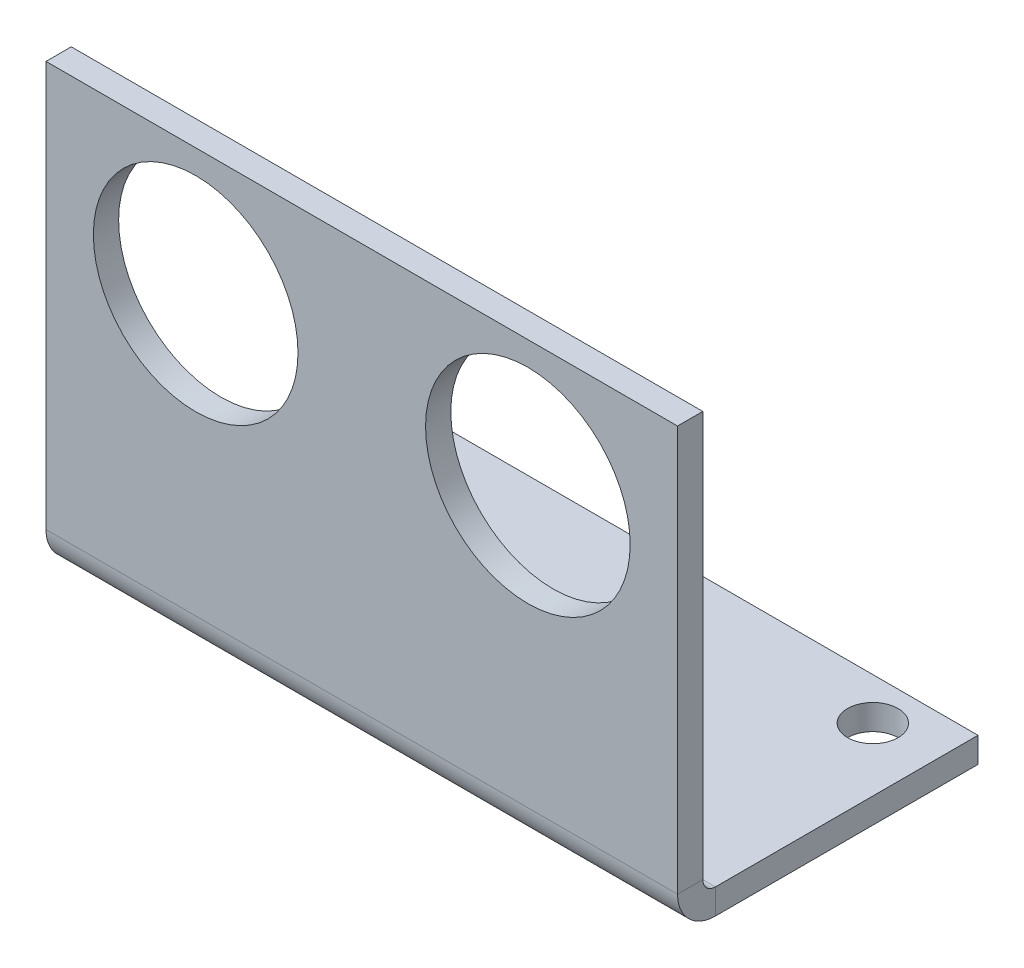
ISO-10303-21;
HEADER;
FILE_DESCRIPTION(('STEP AP214'),'2;1');
FILE_NAME('part.step','',(''),(''),'','','');
FILE_SCHEMA(('AUTOMOTIVE_DESIGN { 1 0 10303 214 1 1 1 1 }'));
ENDSEC;
DATA;
#1=APPLICATION_CONTEXT('core data for automotive mechanical design processes');
#2=APPLICATION_PROTOCOL_DEFINITION('international standard','automotive_design',2000,#1);
#3=PRODUCT_CONTEXT('',#1,'mechanical');
#4=PRODUCT('Part','Part','',(#3));
#5=PRODUCT_RELATED_PRODUCT_CATEGORY('part','',(#4));
#6=PRODUCT_DEFINITION_FORMATION('','',#4);
#7=PRODUCT_DEFINITION_CONTEXT('part definition',#1,'design');
#8=PRODUCT_DEFINITION('design','',#6,#7);
#9=PRODUCT_DEFINITION_SHAPE('','',#8);
#10=(LENGTH_UNIT() NAMED_UNIT(*) SI_UNIT(.MILLI.,.METRE.));
#11=(NAMED_UNIT(*) PLANE_ANGLE_UNIT() SI_UNIT($,.RADIAN.));
#12=(NAMED_UNIT(*) SI_UNIT($,.STERADIAN.) SOLID_ANGLE_UNIT());
#13=UNCERTAINTY_MEASURE_WITH_UNIT(LENGTH_MEASURE(1.E-05),#10,'distance_accuracy_value','');
#14=(GEOMETRIC_REPRESENTATION_CONTEXT(3) GLOBAL_UNCERTAINTY_ASSIGNED_CONTEXT((#13)) GLOBAL_UNIT_ASSIGNED_CONTEXT((#10,
#11,#12)) REPRESENTATION_CONTEXT('',''));
#15=CARTESIAN_POINT('',(0.,0.,0.));
#16=DIRECTION('',(0.,0.,1.));
#17=DIRECTION('',(1.,0.,0.));
#18=AXIS2_PLACEMENT_3D('',#15,#16,#17);
#19=CARTESIAN_POINT('',(0.,0.,2.));
#20=DIRECTION('',(0.,0.,-1.));
#21=DIRECTION('',(-1.,0.,0.));
#22=AXIS2_PLACEMENT_3D('',#19,#20,#21);
#23=PLANE('',#22);
#24=DIRECTION('',(0.,1.,0.));
#25=VECTOR('',#24,1.);
#26=CARTESIAN_POINT('',(25.,-15.,2.));
#27=LINE('',#26,#25);
#28=CARTESIAN_POINT('',(25.,-17.099519781874,2.));
#29=VERTEX_POINT('',#28);
#30=CARTESIAN_POINT('',(25.,15.,2.));
#31=VERTEX_POINT('',#30);
#32=EDGE_CURVE('E226',#29,#31,#27,.T.);
#33=ORIENTED_EDGE('',*,*,#32,.T.);
#34=DIRECTION('',(-1.,0.,0.));
#35=VECTOR('',#34,1.);
#36=CARTESIAN_POINT('',(-25.,15.,2.));
#37=LINE('',#36,#35);
#38=CARTESIAN_POINT('',(-25.,15.,2.));
#39=VERTEX_POINT('',#38);
#40=EDGE_CURVE('E57',#31,#39,#37,.T.);
#41=ORIENTED_EDGE('',*,*,#40,.T.);
#42=DIRECTION('',(0.,-1.,0.));
#43=VECTOR('',#42,1.);
#44=CARTESIAN_POINT('',(-25.,-15.,2.));
#45=LINE('',#44,#43);
#46=CARTESIAN_POINT('',(-25.,-17.099519781874,2.));
#47=VERTEX_POINT('',#46);
#48=EDGE_CURVE('E107',#39,#47,#45,.T.);
#49=ORIENTED_EDGE('',*,*,#48,.T.);
#50=DIRECTION('',(-1.,0.,0.));
#51=VECTOR('',#50,1.);
#52=CARTESIAN_POINT('',(25.,-17.099519781874,2.));
#53=LINE('',#52,#51);
#54=EDGE_CURVE('E111',#29,#47,#53,.T.);
#55=ORIENTED_EDGE('',*,*,#54,.F.);
#56=EDGE_LOOP('',(#33,#41,#49,#55));
#57=FACE_BOUND('',#56,.T.);
#58=CARTESIAN_POINT('',(13.15,5.,2.));
#59=DIRECTION('',(0.,0.,1.));
#60=DIRECTION('',(1.,0.,0.));
#61=AXIS2_PLACEMENT_3D('',#58,#59,#60);
#62=CIRCLE('',#61,8.1);
#63=CARTESIAN_POINT('',(21.25,5.,2.));
#64=VERTEX_POINT('',#63);
#65=EDGE_CURVE('E218',#64,#64,#62,.T.);
#66=ORIENTED_EDGE('',*,*,#65,.F.);
#67=EDGE_LOOP('',(#66));
#68=FACE_BOUND('',#67,.T.);
#69=CARTESIAN_POINT('',(-13.15,5.,2.));
#70=DIRECTION('',(0.,0.,1.));
#71=DIRECTION('',(-1.,0.,0.));
#72=AXIS2_PLACEMENT_3D('',#69,#70,#71);
#73=CIRCLE('',#72,8.1);
#74=CARTESIAN_POINT('',(-21.25,5.,2.));
#75=VERTEX_POINT('',#74);
#76=EDGE_CURVE('E210',#75,#75,#73,.T.);
#77=ORIENTED_EDGE('',*,*,#76,.F.);
#78=EDGE_LOOP('',(#77));
#79=FACE_BOUND('',#78,.T.);
#80=ADVANCED_FACE('F39',(#57,#68,#79),#23,.F.);
#81=CARTESIAN_POINT('',(0.,0.,0.));
#82=DIRECTION('',(0.,0.,-1.));
#83=DIRECTION('',(-1.,0.,0.));
#84=AXIS2_PLACEMENT_3D('',#81,#82,#83);
#85=PLANE('',#84);
#86=CARTESIAN_POINT('',(13.15,5.,0.));
#87=DIRECTION('',(0.,0.,1.));
#88=DIRECTION('',(1.,0.,0.));
#89=AXIS2_PLACEMENT_3D('',#86,#87,#88);
#90=CIRCLE('',#89,8.1);
#91=CARTESIAN_POINT('',(21.25,5.,0.));
#92=VERTEX_POINT('',#91);
#93=EDGE_CURVE('E214',#92,#92,#90,.T.);
#94=ORIENTED_EDGE('',*,*,#93,.T.);
#95=EDGE_LOOP('',(#94));
#96=FACE_BOUND('',#95,.T.);
#97=DIRECTION('',(0.,1.,0.));
#98=VECTOR('',#97,1.);
#99=CARTESIAN_POINT('',(25.,-15.,0.));
#100=LINE('',#99,#98);
#101=CARTESIAN_POINT('',(25.,-17.099519781874,0.));
#102=VERTEX_POINT('',#101);
#103=CARTESIAN_POINT('',(25.,15.,0.));
#104=VERTEX_POINT('',#103);
#105=EDGE_CURVE('E222',#102,#104,#100,.T.);
#106=ORIENTED_EDGE('',*,*,#105,.F.);
#107=DIRECTION('',(1.,0.,0.));
#108=VECTOR('',#107,1.);
#109=CARTESIAN_POINT('',(-25.,-17.099519781874,0.));
#110=LINE('',#109,#108);
#111=CARTESIAN_POINT('',(-25.,-17.099519781874,0.));
#112=VERTEX_POINT('',#111);
#113=EDGE_CURVE('E143',#112,#102,#110,.T.);
#114=ORIENTED_EDGE('',*,*,#113,.F.);
#115=DIRECTION('',(0.,-1.,0.));
#116=VECTOR('',#115,1.);
#117=CARTESIAN_POINT('',(-25.,-15.,0.));
#118=LINE('',#117,#116);
#119=CARTESIAN_POINT('',(-25.,15.,0.));
#120=VERTEX_POINT('',#119);
#121=EDGE_CURVE('E140',#120,#112,#118,.T.);
#122=ORIENTED_EDGE('',*,*,#121,.F.);
#123=DIRECTION('',(-1.,0.,0.));
#124=VECTOR('',#123,1.);
#125=CARTESIAN_POINT('',(-25.,15.,0.));
#126=LINE('',#125,#124);
#127=EDGE_CURVE('E68',#104,#120,#126,.T.);
#128=ORIENTED_EDGE('',*,*,#127,.F.);
#129=EDGE_LOOP('',(#106,#114,#122,#128));
#130=FACE_BOUND('',#129,.T.);
#131=CARTESIAN_POINT('',(-13.15,5.,0.));
#132=DIRECTION('',(0.,0.,1.));
#133=DIRECTION('',(-1.,0.,0.));
#134=AXIS2_PLACEMENT_3D('',#131,#132,#133);
#135=CIRCLE('',#134,8.1);
#136=CARTESIAN_POINT('',(-21.25,5.,0.));
#137=VERTEX_POINT('',#136);
#138=EDGE_CURVE('E209',#137,#137,#135,.T.);
#139=ORIENTED_EDGE('',*,*,#138,.T.);
#140=EDGE_LOOP('',(#139));
#141=FACE_BOUND('',#140,.T.);
#142=ADVANCED_FACE('F240',(#96,#130,#141),#85,.T.);
#143=CARTESIAN_POINT('',(25.,-15.,2.));
#144=DIRECTION('',(-1.,0.,0.));
#145=DIRECTION('',(0.,0.,1.));
#146=AXIS2_PLACEMENT_3D('',#143,#144,#145);
#147=PLANE('',#146);
#148=ORIENTED_EDGE('',*,*,#105,.T.);
#149=DIRECTION('',(0.,0.,-1.));
#150=VECTOR('',#149,1.);
#151=CARTESIAN_POINT('',(25.,15.,2.));
#152=LINE('',#151,#150);
#153=EDGE_CURVE('E11',#31,#104,#152,.T.);
#154=ORIENTED_EDGE('',*,*,#153,.F.);
#155=ORIENTED_EDGE('',*,*,#32,.F.);
#156=DIRECTION('',(0.,0.,1.));
#157=VECTOR('',#156,1.);
#158=CARTESIAN_POINT('',(25.,-17.099519781874,0.));
#159=LINE('',#158,#157);
#160=EDGE_CURVE('E137',#102,#29,#159,.T.);
#161=ORIENTED_EDGE('',*,*,#160,.F.);
#162=EDGE_LOOP('',(#148,#154,#155,#161));
#163=FACE_BOUND('',#162,.T.);
#164=ADVANCED_FACE('F41',(#163),#147,.F.);
#165=CARTESIAN_POINT('',(-25.,15.,2.));
#166=DIRECTION('',(0.,-1.,0.));
#167=DIRECTION('',(1.,0.,0.));
#168=AXIS2_PLACEMENT_3D('',#165,#166,#167);
#169=PLANE('',#168);
#170=ORIENTED_EDGE('',*,*,#127,.T.);
#171=DIRECTION('',(0.,0.,-1.));
#172=VECTOR('',#171,1.);
#173=CARTESIAN_POINT('',(-25.,15.,2.));
#174=LINE('',#173,#172);
#175=EDGE_CURVE('E49',#39,#120,#174,.T.);
#176=ORIENTED_EDGE('',*,*,#175,.F.);
#177=ORIENTED_EDGE('',*,*,#40,.F.);
#178=ORIENTED_EDGE('',*,*,#153,.T.);
#179=EDGE_LOOP('',(#170,#176,#177,#178));
#180=FACE_BOUND('',#179,.T.);
#181=ADVANCED_FACE('F288',(#180),#169,.F.);
#182=CARTESIAN_POINT('',(-25.,-15.,2.));
#183=DIRECTION('',(1.,0.,0.));
#184=DIRECTION('',(0.,0.,-1.));
#185=AXIS2_PLACEMENT_3D('',#182,#183,#184);
#186=PLANE('',#185);
#187=ORIENTED_EDGE('',*,*,#121,.T.);
#188=DIRECTION('',(0.,0.,-1.));
#189=VECTOR('',#188,1.);
#190=CARTESIAN_POINT('',(-25.,-17.099519781874,2.));
#191=LINE('',#190,#189);
#192=EDGE_CURVE('E125',#47,#112,#191,.T.);
#193=ORIENTED_EDGE('',*,*,#192,.F.);
#194=ORIENTED_EDGE('',*,*,#48,.F.);
#195=ORIENTED_EDGE('',*,*,#175,.T.);
#196=EDGE_LOOP('',(#187,#193,#194,#195));
#197=FACE_BOUND('',#196,.T.);
#198=ADVANCED_FACE('F139',(#197),#186,.F.);
#199=CARTESIAN_POINT('',(13.15,5.,2.));
#200=DIRECTION('',(0.,0.,-1.));
#201=DIRECTION('',(-1.,0.,0.));
#202=AXIS2_PLACEMENT_3D('',#199,#200,#201);
#203=CYLINDRICAL_SURFACE('',#202,8.1);
#204=ORIENTED_EDGE('',*,*,#65,.T.);
#205=EDGE_LOOP('',(#204));
#206=FACE_BOUND('',#205,.T.);
#207=ORIENTED_EDGE('',*,*,#93,.F.);
#208=EDGE_LOOP('',(#207));
#209=FACE_BOUND('',#208,.T.);
#210=ADVANCED_FACE('F270',(#206,#209),#203,.F.);
#211=CARTESIAN_POINT('',(-13.15,5.,2.));
#212=DIRECTION('',(0.,0.,-1.));
#213=DIRECTION('',(-1.,0.,0.));
#214=AXIS2_PLACEMENT_3D('',#211,#212,#213);
#215=CYLINDRICAL_SURFACE('',#214,8.1);
#216=ORIENTED_EDGE('',*,*,#76,.T.);
#217=EDGE_LOOP('',(#216));
#218=FACE_BOUND('',#217,.T.);
#219=ORIENTED_EDGE('',*,*,#138,.F.);
#220=EDGE_LOOP('',(#219));
#221=FACE_BOUND('',#220,.T.);
#222=ADVANCED_FACE('F262',(#218,#221),#215,.F.);
#223=CARTESIAN_POINT('',(0.,-18.099519781874,-21.7876275037138));
#224=DIRECTION('',(0.,0.,-1.));
#225=DIRECTION('',(0.,1.,0.));
#226=AXIS2_PLACEMENT_3D('',#223,#224,#225);
#227=PLANE('',#226);
#228=DIRECTION('',(0.,1.,0.));
#229=VECTOR('',#228,1.);
#230=CARTESIAN_POINT('',(-25.,-20.099519781874,-21.7876275037138));
#231=LINE('',#230,#229);
#232=CARTESIAN_POINT('',(-25.,-20.099519781874,-21.7876275037138));
#233=VERTEX_POINT('',#232);
#234=CARTESIAN_POINT('',(-25.,-18.099519781874,-21.7876275037138));
#235=VERTEX_POINT('',#234);
#236=EDGE_CURVE('E163',#233,#235,#231,.T.);
#237=ORIENTED_EDGE('',*,*,#236,.T.);
#238=DIRECTION('',(1.,0.,0.));
#239=VECTOR('',#238,1.);
#240=CARTESIAN_POINT('',(-25.,-18.099519781874,-21.7876275037138));
#241=LINE('',#240,#239);
#242=CARTESIAN_POINT('',(25.,-18.099519781874,-21.7876275037138));
#243=VERTEX_POINT('',#242);
#244=EDGE_CURVE('E171',#235,#243,#241,.T.);
#245=ORIENTED_EDGE('',*,*,#244,.T.);
#246=DIRECTION('',(0.,-1.,0.));
#247=VECTOR('',#246,1.);
#248=CARTESIAN_POINT('',(25.,-18.099519781874,-21.7876275037138));
#249=LINE('',#248,#247);
#250=CARTESIAN_POINT('',(25.,-20.099519781874,-21.7876275037138));
#251=VERTEX_POINT('',#250);
#252=EDGE_CURVE('E75',#243,#251,#249,.T.);
#253=ORIENTED_EDGE('',*,*,#252,.T.);
#254=DIRECTION('',(-1.,0.,0.));
#255=VECTOR('',#254,1.);
#256=CARTESIAN_POINT('',(25.,-20.099519781874,-21.7876275037138));
#257=LINE('',#256,#255);
#258=EDGE_CURVE('E202',#251,#233,#257,.T.);
#259=ORIENTED_EDGE('',*,*,#258,.T.);
#260=EDGE_LOOP('',(#237,#245,#253,#259));
#261=FACE_BOUND('',#260,.T.);
#262=ADVANCED_FACE('F260',(#261),#227,.T.);
#263=CARTESIAN_POINT('',(-25.,-17.099519781874,1.99999999999987));
#264=DIRECTION('',(-1.,0.,0.));
#265=DIRECTION('',(0.,0.,1.));
#266=AXIS2_PLACEMENT_3D('',#263,#264,#265);
#267=PLANE('',#266);
#268=CARTESIAN_POINT('',(-25.,-17.099519781874,-1.));
#269=DIRECTION('',(1.,0.,0.));
#270=DIRECTION('',(0.,0.,1.));
#271=AXIS2_PLACEMENT_3D('',#268,#269,#270);
#272=CIRCLE('',#271,0.999999999999869);
#273=CARTESIAN_POINT('',(-25.,-18.0995197818739,-1.00000000000001));
#274=VERTEX_POINT('',#273);
#275=EDGE_CURVE('E159',#112,#274,#272,.T.);
#276=ORIENTED_EDGE('',*,*,#275,.T.);
#277=DIRECTION('',(0.,1.,0.));
#278=VECTOR('',#277,1.);
#279=CARTESIAN_POINT('',(-25.,-20.099519781874,-1.00000000000002));
#280=LINE('',#279,#278);
#281=CARTESIAN_POINT('',(-25.,-20.0995197818739,-1.00000000000002));
#282=VERTEX_POINT('',#281);
#283=EDGE_CURVE('E127',#282,#274,#280,.T.);
#284=ORIENTED_EDGE('',*,*,#283,.F.);
#285=CARTESIAN_POINT('',(-25.,-17.099519781874,-1.));
#286=DIRECTION('',(1.,0.,0.));
#287=DIRECTION('',(0.,0.,1.));
#288=AXIS2_PLACEMENT_3D('',#285,#286,#287);
#289=CIRCLE('',#288,2.99999999999987);
#290=EDGE_CURVE('E122',#47,#282,#289,.T.);
#291=ORIENTED_EDGE('',*,*,#290,.F.);
#292=ORIENTED_EDGE('',*,*,#192,.T.);
#293=EDGE_LOOP('',(#276,#284,#291,#292));
#294=FACE_BOUND('',#293,.T.);
#295=ADVANCED_FACE('F124',(#294),#267,.T.);
#296=CARTESIAN_POINT('',(25.,-17.099519781874,-1.));
#297=DIRECTION('',(1.,0.,0.));
#298=DIRECTION('',(0.,0.,-1.));
#299=AXIS2_PLACEMENT_3D('',#296,#297,#298);
#300=CYLINDRICAL_SURFACE('',#299,0.999999999999869);
#301=CARTESIAN_POINT('',(25.,-17.099519781874,-1.));
#302=DIRECTION('',(1.,0.,0.));
#303=DIRECTION('',(0.,0.,1.));
#304=AXIS2_PLACEMENT_3D('',#301,#302,#303);
#305=CIRCLE('',#304,0.999999999999869);
#306=CARTESIAN_POINT('',(25.,-18.0995197818739,-1.00000000000001));
#307=VERTEX_POINT('',#306);
#308=EDGE_CURVE('E179',#102,#307,#305,.T.);
#309=ORIENTED_EDGE('',*,*,#308,.T.);
#310=DIRECTION('',(1.,0.,0.));
#311=VECTOR('',#310,1.);
#312=CARTESIAN_POINT('',(-25.,-18.099519781874,-1.00000000000001));
#313=LINE('',#312,#311);
#314=EDGE_CURVE('E161',#274,#307,#313,.T.);
#315=ORIENTED_EDGE('',*,*,#314,.F.);
#316=ORIENTED_EDGE('',*,*,#275,.F.);
#317=ORIENTED_EDGE('',*,*,#113,.T.);
#318=EDGE_LOOP('',(#309,#315,#316,#317));
#319=FACE_BOUND('',#318,.T.);
#320=ADVANCED_FACE('F244',(#319),#300,.F.);
#321=CARTESIAN_POINT('',(25.,-17.099519781874,-1.30537941567255E-13));
#322=DIRECTION('',(1.,0.,0.));
#323=DIRECTION('',(0.,0.,-1.));
#324=AXIS2_PLACEMENT_3D('',#321,#322,#323);
#325=PLANE('',#324);
#326=CARTESIAN_POINT('',(25.,-17.099519781874,-1.));
#327=DIRECTION('',(1.,0.,0.));
#328=DIRECTION('',(0.,0.,1.));
#329=AXIS2_PLACEMENT_3D('',#326,#327,#328);
#330=CIRCLE('',#329,2.99999999999987);
#331=CARTESIAN_POINT('',(25.,-20.0995197818739,-1.00000000000002));
#332=VERTEX_POINT('',#331);
#333=EDGE_CURVE('E135',#29,#332,#330,.T.);
#334=ORIENTED_EDGE('',*,*,#333,.T.);
#335=DIRECTION('',(0.,-1.,0.));
#336=VECTOR('',#335,1.);
#337=CARTESIAN_POINT('',(25.,-18.099519781874,-1.00000000000001));
#338=LINE('',#337,#336);
#339=EDGE_CURVE('E183',#307,#332,#338,.T.);
#340=ORIENTED_EDGE('',*,*,#339,.F.);
#341=ORIENTED_EDGE('',*,*,#308,.F.);
#342=ORIENTED_EDGE('',*,*,#160,.T.);
#343=EDGE_LOOP('',(#334,#340,#341,#342));
#344=FACE_BOUND('',#343,.T.);
#345=ADVANCED_FACE('F253',(#344),#325,.T.);
#346=CARTESIAN_POINT('',(25.,-17.099519781874,-1.));
#347=DIRECTION('',(1.,0.,0.));
#348=DIRECTION('',(0.,0.,-1.));
#349=AXIS2_PLACEMENT_3D('',#346,#347,#348);
#350=CYLINDRICAL_SURFACE('',#349,2.99999999999987);
#351=DIRECTION('',(-1.,0.,0.));
#352=VECTOR('',#351,1.);
#353=CARTESIAN_POINT('',(25.,-20.099519781874,-1.00000000000002));
#354=LINE('',#353,#352);
#355=EDGE_CURVE('E174',#332,#282,#354,.T.);
#356=ORIENTED_EDGE('',*,*,#355,.F.);
#357=ORIENTED_EDGE('',*,*,#333,.F.);
#358=ORIENTED_EDGE('',*,*,#54,.T.);
#359=ORIENTED_EDGE('',*,*,#290,.T.);
#360=EDGE_LOOP('',(#356,#357,#358,#359));
#361=FACE_BOUND('',#360,.T.);
#362=ADVANCED_FACE('F133',(#361),#350,.T.);
#363=CARTESIAN_POINT('',(-25.,-20.099519781874,-1.00000000000001));
#364=DIRECTION('',(-1.,0.,0.));
#365=DIRECTION('',(0.,0.,1.));
#366=AXIS2_PLACEMENT_3D('',#363,#364,#365);
#367=PLANE('',#366);
#368=DIRECTION('',(0.,0.,-1.));
#369=VECTOR('',#368,1.);
#370=CARTESIAN_POINT('',(-25.,-18.099519781874,-1.00000000000001));
#371=LINE('',#370,#369);
#372=EDGE_CURVE('E166',#274,#235,#371,.T.);
#373=ORIENTED_EDGE('',*,*,#372,.T.);
#374=ORIENTED_EDGE('',*,*,#236,.F.);
#375=DIRECTION('',(0.,0.,-1.));
#376=VECTOR('',#375,1.);
#377=CARTESIAN_POINT('',(-25.,-20.099519781874,-1.00000000000001));
#378=LINE('',#377,#376);
#379=EDGE_CURVE('E167',#282,#233,#378,.T.);
#380=ORIENTED_EDGE('',*,*,#379,.F.);
#381=ORIENTED_EDGE('',*,*,#283,.T.);
#382=EDGE_LOOP('',(#373,#374,#380,#381));
#383=FACE_BOUND('',#382,.T.);
#384=ADVANCED_FACE('F247',(#383),#367,.T.);
#385=CARTESIAN_POINT('',(-25.,-18.099519781874,-1.00000000000001));
#386=DIRECTION('',(0.,1.,0.));
#387=DIRECTION('',(0.,0.,1.));
#388=AXIS2_PLACEMENT_3D('',#385,#386,#387);
#389=PLANE('',#388);
#390=CARTESIAN_POINT('',(-20.,-18.099519781874,-18.4604377762795));
#391=DIRECTION('',(0.,1.,0.));
#392=DIRECTION('',(0.,0.,1.));
#393=AXIS2_PLACEMENT_3D('',#390,#391,#392);
#394=CIRCLE('',#393,2.);
#395=CARTESIAN_POINT('',(-20.,-18.099519781874,-16.4604377762795));
#396=VERTEX_POINT('',#395);
#397=EDGE_CURVE('E151',#396,#396,#394,.T.);
#398=ORIENTED_EDGE('',*,*,#397,.F.);
#399=EDGE_LOOP('',(#398));
#400=FACE_BOUND('',#399,.T.);
#401=CARTESIAN_POINT('',(20.,-18.099519781874,-18.4604377762795));
#402=DIRECTION('',(0.,1.,0.));
#403=DIRECTION('',(0.,0.,-1.));
#404=AXIS2_PLACEMENT_3D('',#401,#402,#403);
#405=CIRCLE('',#404,2.);
#406=CARTESIAN_POINT('',(20.,-18.099519781874,-20.4604377762795));
#407=VERTEX_POINT('',#406);
#408=EDGE_CURVE('E155',#407,#407,#405,.T.);
#409=ORIENTED_EDGE('',*,*,#408,.F.);
#410=EDGE_LOOP('',(#409));
#411=FACE_BOUND('',#410,.T.);
#412=DIRECTION('',(0.,0.,-1.));
#413=VECTOR('',#412,1.);
#414=CARTESIAN_POINT('',(25.,-18.099519781874,-1.00000000000001));
#415=LINE('',#414,#413);
#416=EDGE_CURVE('E186',#307,#243,#415,.T.);
#417=ORIENTED_EDGE('',*,*,#416,.T.);
#418=ORIENTED_EDGE('',*,*,#244,.F.);
#419=ORIENTED_EDGE('',*,*,#372,.F.);
#420=ORIENTED_EDGE('',*,*,#314,.T.);
#421=EDGE_LOOP('',(#417,#418,#419,#420));
#422=FACE_BOUND('',#421,.T.);
#423=ADVANCED_FACE('F259',(#400,#411,#422),#389,.T.);
#424=CARTESIAN_POINT('',(25.,-18.099519781874,-1.00000000000001));
#425=DIRECTION('',(1.,0.,0.));
#426=DIRECTION('',(0.,0.,-1.));
#427=AXIS2_PLACEMENT_3D('',#424,#425,#426);
#428=PLANE('',#427);
#429=DIRECTION('',(0.,0.,-1.));
#430=VECTOR('',#429,1.);
#431=CARTESIAN_POINT('',(25.,-20.099519781874,-1.00000000000001));
#432=LINE('',#431,#430);
#433=EDGE_CURVE('E199',#332,#251,#432,.T.);
#434=ORIENTED_EDGE('',*,*,#433,.T.);
#435=ORIENTED_EDGE('',*,*,#252,.F.);
#436=ORIENTED_EDGE('',*,*,#416,.F.);
#437=ORIENTED_EDGE('',*,*,#339,.T.);
#438=EDGE_LOOP('',(#434,#435,#436,#437));
#439=FACE_BOUND('',#438,.T.);
#440=ADVANCED_FACE('F256',(#439),#428,.T.);
#441=CARTESIAN_POINT('',(25.,-20.099519781874,-1.00000000000001));
#442=DIRECTION('',(0.,-1.,0.));
#443=DIRECTION('',(0.,0.,-1.));
#444=AXIS2_PLACEMENT_3D('',#441,#442,#443);
#445=PLANE('',#444);
#446=CARTESIAN_POINT('',(-20.,-20.099519781874,-18.4604377762795));
#447=DIRECTION('',(0.,1.,0.));
#448=DIRECTION('',(0.,0.,1.));
#449=AXIS2_PLACEMENT_3D('',#446,#447,#448);
#450=CIRCLE('',#449,2.);
#451=CARTESIAN_POINT('',(-20.,-20.099519781874,-16.4604377762795));
#452=VERTEX_POINT('',#451);
#453=EDGE_CURVE('E144',#452,#452,#450,.T.);
#454=ORIENTED_EDGE('',*,*,#453,.T.);
#455=EDGE_LOOP('',(#454));
#456=FACE_BOUND('',#455,.T.);
#457=CARTESIAN_POINT('',(20.,-20.099519781874,-18.4604377762795));
#458=DIRECTION('',(0.,1.,0.));
#459=DIRECTION('',(0.,0.,-1.));
#460=AXIS2_PLACEMENT_3D('',#457,#458,#459);
#461=CIRCLE('',#460,2.);
#462=CARTESIAN_POINT('',(20.,-20.099519781874,-20.4604377762795));
#463=VERTEX_POINT('',#462);
#464=EDGE_CURVE('E429',#463,#463,#461,.T.);
#465=ORIENTED_EDGE('',*,*,#464,.T.);
#466=EDGE_LOOP('',(#465));
#467=FACE_BOUND('',#466,.T.);
#468=ORIENTED_EDGE('',*,*,#258,.F.);
#469=ORIENTED_EDGE('',*,*,#433,.F.);
#470=ORIENTED_EDGE('',*,*,#355,.T.);
#471=ORIENTED_EDGE('',*,*,#379,.T.);
#472=EDGE_LOOP('',(#468,#469,#470,#471));
#473=FACE_BOUND('',#472,.T.);
#474=ADVANCED_FACE('F250',(#456,#467,#473),#445,.T.);
#475=CARTESIAN_POINT('',(20.,-20.099519781874,-18.4604377762795));
#476=DIRECTION('',(0.,1.,0.));
#477=DIRECTION('',(0.,0.,1.));
#478=AXIS2_PLACEMENT_3D('',#475,#476,#477);
#479=CYLINDRICAL_SURFACE('',#478,2.);
#480=ORIENTED_EDGE('',*,*,#464,.F.);
#481=EDGE_LOOP('',(#480));
#482=FACE_BOUND('',#481,.T.);
#483=ORIENTED_EDGE('',*,*,#408,.T.);
#484=EDGE_LOOP('',(#483));
#485=FACE_BOUND('',#484,.T.);
#486=ADVANCED_FACE('F264',(#482,#485),#479,.F.);
#487=CARTESIAN_POINT('',(-20.,-20.099519781874,-18.4604377762795));
#488=DIRECTION('',(0.,1.,0.));
#489=DIRECTION('',(0.,0.,1.));
#490=AXIS2_PLACEMENT_3D('',#487,#488,#489);
#491=CYLINDRICAL_SURFACE('',#490,2.);
#492=ORIENTED_EDGE('',*,*,#453,.F.);
#493=EDGE_LOOP('',(#492));
#494=FACE_BOUND('',#493,.T.);
#495=ORIENTED_EDGE('',*,*,#397,.T.);
#496=EDGE_LOOP('',(#495));
#497=FACE_BOUND('',#496,.T.);
#498=ADVANCED_FACE('F275',(#494,#497),#491,.F.);
#499=CLOSED_SHELL('',(#80,#142,#164,#181,#198,#210,#222,#262,#295,#320,#345,#362,#384,#423,#440,
#474,#486,#498));
#500=MANIFOLD_SOLID_BREP('B2',#499);
#501=ADVANCED_BREP_SHAPE_REPRESENTATION('',(#18,#500),#14);
#502=SHAPE_DEFINITION_REPRESENTATION(#9,#501);
ENDSEC;
END-ISO-10303-21;
